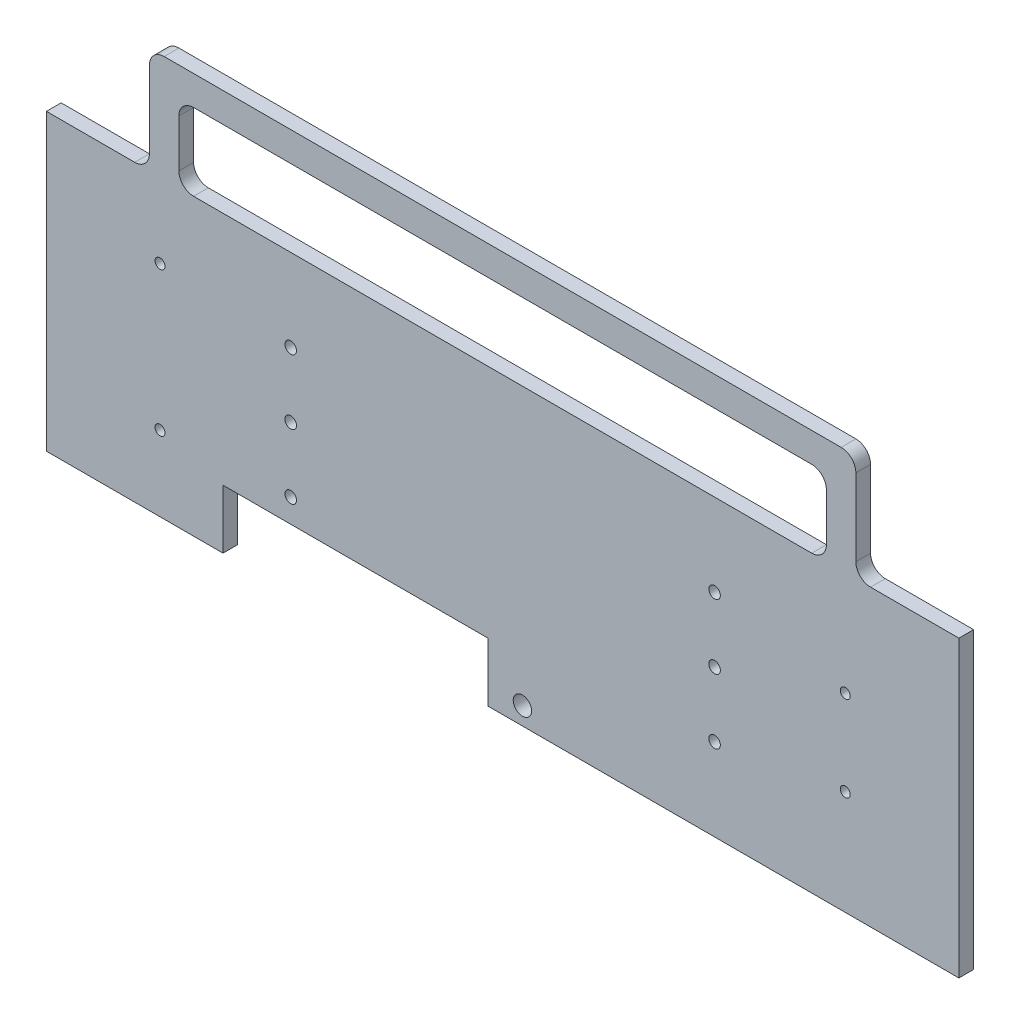
ISO-10303-21;
HEADER;
FILE_DESCRIPTION(('STEP AP214'),'2;1');
FILE_NAME('part.step','',(''),(''),'','','');
FILE_SCHEMA(('AUTOMOTIVE_DESIGN { 1 0 10303 214 1 1 1 1 }'));
ENDSEC;
DATA;
#1=APPLICATION_CONTEXT('core data for automotive mechanical design processes');
#2=APPLICATION_PROTOCOL_DEFINITION('international standard','automotive_design',2000,#1);
#3=PRODUCT_CONTEXT('',#1,'mechanical');
#4=PRODUCT('Part','Part','',(#3));
#5=PRODUCT_RELATED_PRODUCT_CATEGORY('part','',(#4));
#6=PRODUCT_DEFINITION_FORMATION('','',#4);
#7=PRODUCT_DEFINITION_CONTEXT('part definition',#1,'design');
#8=PRODUCT_DEFINITION('design','',#6,#7);
#9=PRODUCT_DEFINITION_SHAPE('','',#8);
#10=(LENGTH_UNIT() NAMED_UNIT(*) SI_UNIT(.MILLI.,.METRE.));
#11=(NAMED_UNIT(*) PLANE_ANGLE_UNIT() SI_UNIT($,.RADIAN.));
#12=(NAMED_UNIT(*) SI_UNIT($,.STERADIAN.) SOLID_ANGLE_UNIT());
#13=UNCERTAINTY_MEASURE_WITH_UNIT(LENGTH_MEASURE(1.E-05),#10,'distance_accuracy_value','');
#14=(GEOMETRIC_REPRESENTATION_CONTEXT(3) GLOBAL_UNCERTAINTY_ASSIGNED_CONTEXT((#13)) GLOBAL_UNIT_ASSIGNED_CONTEXT((#10,
#11,#12)) REPRESENTATION_CONTEXT('',''));
#15=CARTESIAN_POINT('',(0.,0.,0.));
#16=DIRECTION('',(0.,0.,1.));
#17=DIRECTION('',(1.,0.,0.));
#18=AXIS2_PLACEMENT_3D('',#15,#16,#17);
#19=CARTESIAN_POINT('',(-196.85,-63.5,6.35));
#20=DIRECTION('',(0.,1.,0.));
#21=DIRECTION('',(0.,0.,1.));
#22=AXIS2_PLACEMENT_3D('',#19,#20,#21);
#23=PLANE('',#22);
#24=DIRECTION('',(1.,0.,0.));
#25=VECTOR('',#24,1.);
#26=CARTESIAN_POINT('',(-196.85,-63.5,0.));
#27=LINE('',#26,#25);
#28=CARTESIAN_POINT('',(-196.85,-63.5,0.));
#29=VERTEX_POINT('',#28);
#30=CARTESIAN_POINT('',(-120.65,-63.5,0.));
#31=VERTEX_POINT('',#30);
#32=EDGE_CURVE('E218',#29,#31,#27,.T.);
#33=ORIENTED_EDGE('',*,*,#32,.T.);
#34=DIRECTION('',(0.,0.,1.));
#35=VECTOR('',#34,1.);
#36=CARTESIAN_POINT('',(-120.65,-63.5,0.));
#37=LINE('',#36,#35);
#38=CARTESIAN_POINT('',(-120.65,-63.5,6.35));
#39=VERTEX_POINT('',#38);
#40=EDGE_CURVE('E201',#31,#39,#37,.T.);
#41=ORIENTED_EDGE('',*,*,#40,.T.);
#42=DIRECTION('',(1.,0.,0.));
#43=VECTOR('',#42,1.);
#44=CARTESIAN_POINT('',(-196.85,-63.5,6.35));
#45=LINE('',#44,#43);
#46=CARTESIAN_POINT('',(-196.85,-63.5,6.35));
#47=VERTEX_POINT('',#46);
#48=EDGE_CURVE('E239',#47,#39,#45,.T.);
#49=ORIENTED_EDGE('',*,*,#48,.F.);
#50=DIRECTION('',(0.,0.,-1.));
#51=VECTOR('',#50,1.);
#52=CARTESIAN_POINT('',(-196.85,-63.5,6.35));
#53=LINE('',#52,#51);
#54=EDGE_CURVE('E225',#47,#29,#53,.T.);
#55=ORIENTED_EDGE('',*,*,#54,.T.);
#56=EDGE_LOOP('',(#33,#41,#49,#55));
#57=FACE_BOUND('',#56,.T.);
#58=ADVANCED_FACE('F39',(#57),#23,.F.);
#59=CARTESIAN_POINT('',(-196.85,63.5,6.35));
#60=DIRECTION('',(0.,-1.,0.));
#61=DIRECTION('',(0.,0.,-1.));
#62=AXIS2_PLACEMENT_3D('',#59,#60,#61);
#63=PLANE('',#62);
#64=DIRECTION('',(-1.,0.,0.));
#65=VECTOR('',#64,1.);
#66=CARTESIAN_POINT('',(-196.85,63.5,6.35));
#67=LINE('',#66,#65);
#68=CARTESIAN_POINT('',(-158.75,63.5,6.35));
#69=VERTEX_POINT('',#68);
#70=CARTESIAN_POINT('',(-196.85,63.5,6.35));
#71=VERTEX_POINT('',#70);
#72=EDGE_CURVE('E230',#69,#71,#67,.T.);
#73=ORIENTED_EDGE('',*,*,#72,.F.);
#74=DIRECTION('',(0.,0.,1.));
#75=VECTOR('',#74,1.);
#76=CARTESIAN_POINT('',(-158.75,63.5,0.));
#77=LINE('',#76,#75);
#78=CARTESIAN_POINT('',(-158.75,63.5,0.));
#79=VERTEX_POINT('',#78);
#80=EDGE_CURVE('E270',#69,#79,#77,.F.);
#81=ORIENTED_EDGE('',*,*,#80,.T.);
#82=DIRECTION('',(-1.,0.,0.));
#83=VECTOR('',#82,1.);
#84=CARTESIAN_POINT('',(-196.85,63.5,0.));
#85=LINE('',#84,#83);
#86=CARTESIAN_POINT('',(-196.85,63.5,0.));
#87=VERTEX_POINT('',#86);
#88=EDGE_CURVE('E405',#79,#87,#85,.T.);
#89=ORIENTED_EDGE('',*,*,#88,.T.);
#90=DIRECTION('',(0.,0.,-1.));
#91=VECTOR('',#90,1.);
#92=CARTESIAN_POINT('',(-196.85,63.5,6.35));
#93=LINE('',#92,#91);
#94=EDGE_CURVE('E241',#71,#87,#93,.T.);
#95=ORIENTED_EDGE('',*,*,#94,.F.);
#96=EDGE_LOOP('',(#73,#81,#89,#95));
#97=FACE_BOUND('',#96,.T.);
#98=ADVANCED_FACE('F416',(#97),#63,.F.);
#99=CARTESIAN_POINT('',(133.35,63.5,6.35));
#100=VERTEX_POINT('',#99);
#101=CARTESIAN_POINT('',(-133.35,63.5,6.35));
#102=VERTEX_POINT('',#101);
#103=EDGE_CURVE('E400',#100,#102,#67,.T.);
#104=ORIENTED_EDGE('',*,*,#103,.F.);
#105=DIRECTION('',(0.,0.,1.));
#106=VECTOR('',#105,1.);
#107=CARTESIAN_POINT('',(133.35,63.5,0.));
#108=LINE('',#107,#106);
#109=CARTESIAN_POINT('',(133.35,63.5,0.));
#110=VERTEX_POINT('',#109);
#111=EDGE_CURVE('E288',#100,#110,#108,.F.);
#112=ORIENTED_EDGE('',*,*,#111,.T.);
#113=CARTESIAN_POINT('',(-133.35,63.5,0.));
#114=VERTEX_POINT('',#113);
#115=EDGE_CURVE('E408',#110,#114,#85,.T.);
#116=ORIENTED_EDGE('',*,*,#115,.T.);
#117=DIRECTION('',(0.,0.,1.));
#118=VECTOR('',#117,1.);
#119=CARTESIAN_POINT('',(-133.35,63.5,6.35));
#120=LINE('',#119,#118);
#121=EDGE_CURVE('E285',#114,#102,#120,.T.);
#122=ORIENTED_EDGE('',*,*,#121,.T.);
#123=EDGE_LOOP('',(#104,#112,#116,#122));
#124=FACE_BOUND('',#123,.T.);
#125=ADVANCED_FACE('F429',(#124),#63,.F.);
#126=CARTESIAN_POINT('',(196.85,63.5,6.35));
#127=DIRECTION('',(-1.,0.,0.));
#128=DIRECTION('',(0.,-1.,0.));
#129=AXIS2_PLACEMENT_3D('',#126,#127,#128);
#130=PLANE('',#129);
#131=DIRECTION('',(0.,1.,0.));
#132=VECTOR('',#131,1.);
#133=CARTESIAN_POINT('',(196.85,63.5,0.));
#134=LINE('',#133,#132);
#135=CARTESIAN_POINT('',(196.85,-63.5,0.));
#136=VERTEX_POINT('',#135);
#137=CARTESIAN_POINT('',(196.85,63.5,0.));
#138=VERTEX_POINT('',#137);
#139=EDGE_CURVE('E394',#136,#138,#134,.T.);
#140=ORIENTED_EDGE('',*,*,#139,.T.);
#141=DIRECTION('',(0.,0.,-1.));
#142=VECTOR('',#141,1.);
#143=CARTESIAN_POINT('',(196.85,63.5,6.35));
#144=LINE('',#143,#142);
#145=CARTESIAN_POINT('',(196.85,63.5,6.35));
#146=VERTEX_POINT('',#145);
#147=EDGE_CURVE('E244',#146,#138,#144,.T.);
#148=ORIENTED_EDGE('',*,*,#147,.F.);
#149=DIRECTION('',(0.,1.,0.));
#150=VECTOR('',#149,1.);
#151=CARTESIAN_POINT('',(196.85,63.5,6.35));
#152=LINE('',#151,#150);
#153=CARTESIAN_POINT('',(196.85,-63.5,6.35));
#154=VERTEX_POINT('',#153);
#155=EDGE_CURVE('E226',#154,#146,#152,.T.);
#156=ORIENTED_EDGE('',*,*,#155,.F.);
#157=DIRECTION('',(0.,0.,-1.));
#158=VECTOR('',#157,1.);
#159=CARTESIAN_POINT('',(196.85,-63.5,6.35));
#160=LINE('',#159,#158);
#161=EDGE_CURVE('E236',#154,#136,#160,.T.);
#162=ORIENTED_EDGE('',*,*,#161,.T.);
#163=EDGE_LOOP('',(#140,#148,#156,#162));
#164=FACE_BOUND('',#163,.T.);
#165=ADVANCED_FACE('F473',(#164),#130,.F.);
#166=CARTESIAN_POINT('',(158.75,63.5,0.));
#167=VERTEX_POINT('',#166);
#168=EDGE_CURVE('E406',#138,#167,#85,.T.);
#169=ORIENTED_EDGE('',*,*,#168,.T.);
#170=DIRECTION('',(0.,0.,1.));
#171=VECTOR('',#170,1.);
#172=CARTESIAN_POINT('',(158.75,63.5,6.35));
#173=LINE('',#172,#171);
#174=CARTESIAN_POINT('',(158.75,63.5,6.35));
#175=VERTEX_POINT('',#174);
#176=EDGE_CURVE('E272',#167,#175,#173,.T.);
#177=ORIENTED_EDGE('',*,*,#176,.T.);
#178=EDGE_CURVE('E396',#146,#175,#67,.T.);
#179=ORIENTED_EDGE('',*,*,#178,.F.);
#180=ORIENTED_EDGE('',*,*,#147,.T.);
#181=EDGE_LOOP('',(#169,#177,#179,#180));
#182=FACE_BOUND('',#181,.T.);
#183=ADVANCED_FACE('F466',(#182),#63,.F.);
#184=CARTESIAN_POINT('',(-196.85,63.5,6.35));
#185=DIRECTION('',(1.,0.,0.));
#186=DIRECTION('',(0.,1.,0.));
#187=AXIS2_PLACEMENT_3D('',#184,#185,#186);
#188=PLANE('',#187);
#189=DIRECTION('',(0.,-1.,0.));
#190=VECTOR('',#189,1.);
#191=CARTESIAN_POINT('',(-196.85,63.5,0.));
#192=LINE('',#191,#190);
#193=EDGE_CURVE('E232',#87,#29,#192,.T.);
#194=ORIENTED_EDGE('',*,*,#193,.T.);
#195=ORIENTED_EDGE('',*,*,#54,.F.);
#196=DIRECTION('',(0.,-1.,0.));
#197=VECTOR('',#196,1.);
#198=CARTESIAN_POINT('',(-196.85,63.5,6.35));
#199=LINE('',#198,#197);
#200=EDGE_CURVE('E399',#71,#47,#199,.T.);
#201=ORIENTED_EDGE('',*,*,#200,.F.);
#202=ORIENTED_EDGE('',*,*,#94,.T.);
#203=EDGE_LOOP('',(#194,#195,#201,#202));
#204=FACE_BOUND('',#203,.T.);
#205=ADVANCED_FACE('F421',(#204),#188,.F.);
#206=CARTESIAN_POINT('',(-6.35000000000001,-63.5,6.35));
#207=VERTEX_POINT('',#206);
#208=EDGE_CURVE('E402',#207,#154,#45,.T.);
#209=ORIENTED_EDGE('',*,*,#208,.F.);
#210=DIRECTION('',(0.,0.,1.));
#211=VECTOR('',#210,1.);
#212=CARTESIAN_POINT('',(-6.35000000000001,-63.5,0.));
#213=LINE('',#212,#211);
#214=CARTESIAN_POINT('',(-6.35000000000001,-63.5,0.));
#215=VERTEX_POINT('',#214);
#216=EDGE_CURVE('E211',#215,#207,#213,.T.);
#217=ORIENTED_EDGE('',*,*,#216,.F.);
#218=EDGE_CURVE('E227',#215,#136,#27,.T.);
#219=ORIENTED_EDGE('',*,*,#218,.T.);
#220=ORIENTED_EDGE('',*,*,#161,.F.);
#221=EDGE_LOOP('',(#209,#217,#219,#220));
#222=FACE_BOUND('',#221,.T.);
#223=ADVANCED_FACE('F478',(#222),#23,.F.);
#224=CARTESIAN_POINT('',(0.,0.,6.35));
#225=DIRECTION('',(0.,0.,1.));
#226=DIRECTION('',(1.,0.,0.));
#227=AXIS2_PLACEMENT_3D('',#224,#225,#226);
#228=PLANE('',#227);
#229=CARTESIAN_POINT('',(8.53490799999999,-55.88,6.35));
#230=DIRECTION('',(0.,0.,1.));
#231=DIRECTION('',(1.,0.,0.));
#232=AXIS2_PLACEMENT_3D('',#229,#230,#231);
#233=CIRCLE('',#232,3.96875);
#234=CARTESIAN_POINT('',(12.503658,-55.88,6.35));
#235=VERTEX_POINT('',#234);
#236=EDGE_CURVE('E971',#235,#235,#233,.T.);
#237=ORIENTED_EDGE('',*,*,#236,.F.);
#238=EDGE_LOOP('',(#237));
#239=FACE_BOUND('',#238,.T.);
#240=DIRECTION('',(0.,-1.,0.));
#241=VECTOR('',#240,1.);
#242=CARTESIAN_POINT('',(-120.65,-63.5,6.35));
#243=LINE('',#242,#241);
#244=CARTESIAN_POINT('',(-120.65,-38.1,6.35));
#245=VERTEX_POINT('',#244);
#246=EDGE_CURVE('E206',#245,#39,#243,.T.);
#247=ORIENTED_EDGE('',*,*,#246,.F.);
#248=DIRECTION('',(-1.,0.,0.));
#249=VECTOR('',#248,1.);
#250=CARTESIAN_POINT('',(-120.65,-38.1,6.35));
#251=LINE('',#250,#249);
#252=CARTESIAN_POINT('',(-6.35000000000002,-38.1,6.35));
#253=VERTEX_POINT('',#252);
#254=EDGE_CURVE('E221',#253,#245,#251,.T.);
#255=ORIENTED_EDGE('',*,*,#254,.F.);
#256=DIRECTION('',(0.,1.,0.));
#257=VECTOR('',#256,1.);
#258=CARTESIAN_POINT('',(-6.35000000000001,-63.5,6.35));
#259=LINE('',#258,#257);
#260=EDGE_CURVE('E978',#207,#253,#259,.T.);
#261=ORIENTED_EDGE('',*,*,#260,.F.);
#262=ORIENTED_EDGE('',*,*,#208,.T.);
#263=ORIENTED_EDGE('',*,*,#155,.T.);
#264=ORIENTED_EDGE('',*,*,#178,.T.);
#265=CARTESIAN_POINT('',(158.75,69.85,6.35));
#266=DIRECTION('',(0.,0.,1.));
#267=DIRECTION('',(1.,0.,0.));
#268=AXIS2_PLACEMENT_3D('',#265,#266,#267);
#269=CIRCLE('',#268,6.35);
#270=CARTESIAN_POINT('',(152.4,69.85,6.35));
#271=VERTEX_POINT('',#270);
#272=EDGE_CURVE('E299',#175,#271,#269,.F.);
#273=ORIENTED_EDGE('',*,*,#272,.T.);
#274=DIRECTION('',(0.,1.,0.));
#275=VECTOR('',#274,1.);
#276=CARTESIAN_POINT('',(152.4,0.,6.35));
#277=LINE('',#276,#275);
#278=CARTESIAN_POINT('',(152.4,103.033049990493,6.35));
#279=VERTEX_POINT('',#278);
#280=EDGE_CURVE('E353',#271,#279,#277,.T.);
#281=ORIENTED_EDGE('',*,*,#280,.T.);
#282=CARTESIAN_POINT('',(146.05,103.033049990493,6.35));
#283=DIRECTION('',(0.,0.,1.));
#284=DIRECTION('',(1.,0.,0.));
#285=AXIS2_PLACEMENT_3D('',#282,#283,#284);
#286=CIRCLE('',#285,6.35);
#287=CARTESIAN_POINT('',(146.05,109.383049990493,6.35));
#288=VERTEX_POINT('',#287);
#289=EDGE_CURVE('E254',#279,#288,#286,.T.);
#290=ORIENTED_EDGE('',*,*,#289,.T.);
#291=DIRECTION('',(1.,0.,0.));
#292=VECTOR('',#291,1.);
#293=CARTESIAN_POINT('',(0.,109.383049990493,6.35));
#294=LINE('',#293,#292);
#295=CARTESIAN_POINT('',(-146.05,109.383049990493,6.35));
#296=VERTEX_POINT('',#295);
#297=EDGE_CURVE('E356',#296,#288,#294,.T.);
#298=ORIENTED_EDGE('',*,*,#297,.F.);
#299=CARTESIAN_POINT('',(-146.05,103.033049990493,6.35));
#300=DIRECTION('',(0.,0.,1.));
#301=DIRECTION('',(1.,0.,0.));
#302=AXIS2_PLACEMENT_3D('',#299,#300,#301);
#303=CIRCLE('',#302,6.35);
#304=CARTESIAN_POINT('',(-152.4,103.033049990493,6.35));
#305=VERTEX_POINT('',#304);
#306=EDGE_CURVE('E252',#296,#305,#303,.T.);
#307=ORIENTED_EDGE('',*,*,#306,.T.);
#308=DIRECTION('',(0.,1.,0.));
#309=VECTOR('',#308,1.);
#310=CARTESIAN_POINT('',(-152.4,0.,6.35));
#311=LINE('',#310,#309);
#312=CARTESIAN_POINT('',(-152.4,69.85,6.35));
#313=VERTEX_POINT('',#312);
#314=EDGE_CURVE('E359',#313,#305,#311,.T.);
#315=ORIENTED_EDGE('',*,*,#314,.F.);
#316=CARTESIAN_POINT('',(-158.75,69.85,6.35));
#317=DIRECTION('',(0.,0.,1.));
#318=DIRECTION('',(1.,0.,0.));
#319=AXIS2_PLACEMENT_3D('',#316,#317,#318);
#320=CIRCLE('',#319,6.35);
#321=EDGE_CURVE('E295',#313,#69,#320,.F.);
#322=ORIENTED_EDGE('',*,*,#321,.T.);
#323=ORIENTED_EDGE('',*,*,#72,.T.);
#324=ORIENTED_EDGE('',*,*,#200,.T.);
#325=ORIENTED_EDGE('',*,*,#48,.T.);
#326=EDGE_LOOP('',(#247,#255,#261,#262,#263,#264,#273,#281,#290,#298,#307,#315,#322,#323,#324,#325));
#327=FACE_BOUND('',#326,.T.);
#328=CARTESIAN_POINT('',(-147.828,31.115,6.35));
#329=DIRECTION('',(0.,0.,1.));
#330=DIRECTION('',(1.,0.,0.));
#331=AXIS2_PLACEMENT_3D('',#328,#329,#330);
#332=CIRCLE('',#331,2.15265000000001);
#333=CARTESIAN_POINT('',(-145.67535,31.115,6.35));
#334=VERTEX_POINT('',#333);
#335=EDGE_CURVE('E487',#334,#334,#332,.T.);
#336=ORIENTED_EDGE('',*,*,#335,.F.);
#337=EDGE_LOOP('',(#336));
#338=FACE_BOUND('',#337,.T.);
#339=CARTESIAN_POINT('',(-147.828,-31.115,6.35));
#340=DIRECTION('',(0.,0.,1.));
#341=DIRECTION('',(1.,0.,0.));
#342=AXIS2_PLACEMENT_3D('',#339,#340,#341);
#343=CIRCLE('',#342,2.15265000000001);
#344=CARTESIAN_POINT('',(-145.67535,-31.115,6.35));
#345=VERTEX_POINT('',#344);
#346=EDGE_CURVE('E493',#345,#345,#343,.T.);
#347=ORIENTED_EDGE('',*,*,#346,.F.);
#348=EDGE_LOOP('',(#347));
#349=FACE_BOUND('',#348,.T.);
#350=CARTESIAN_POINT('',(147.828,18.415,6.35));
#351=DIRECTION('',(0.,0.,1.));
#352=DIRECTION('',(1.,0.,0.));
#353=AXIS2_PLACEMENT_3D('',#350,#351,#352);
#354=CIRCLE('',#353,2.15265000000001);
#355=CARTESIAN_POINT('',(149.98065,18.415,6.35));
#356=VERTEX_POINT('',#355);
#357=EDGE_CURVE('E499',#356,#356,#354,.T.);
#358=ORIENTED_EDGE('',*,*,#357,.F.);
#359=EDGE_LOOP('',(#358));
#360=FACE_BOUND('',#359,.T.);
#361=CARTESIAN_POINT('',(147.828,-18.415,6.35));
#362=DIRECTION('',(0.,0.,1.));
#363=DIRECTION('',(1.,0.,0.));
#364=AXIS2_PLACEMENT_3D('',#361,#362,#363);
#365=CIRCLE('',#364,2.15265000000001);
#366=CARTESIAN_POINT('',(149.98065,-18.415,6.35));
#367=VERTEX_POINT('',#366);
#368=EDGE_CURVE('E505',#367,#367,#365,.T.);
#369=ORIENTED_EDGE('',*,*,#368,.F.);
#370=EDGE_LOOP('',(#369));
#371=FACE_BOUND('',#370,.T.);
#372=CARTESIAN_POINT('',(-91.44,27.94,6.35));
#373=DIRECTION('',(0.,0.,1.));
#374=DIRECTION('',(1.,0.,0.));
#375=AXIS2_PLACEMENT_3D('',#372,#373,#374);
#376=CIRCLE('',#375,2.48919999999998);
#377=CARTESIAN_POINT('',(-88.9508,27.94,6.35));
#378=VERTEX_POINT('',#377);
#379=EDGE_CURVE('E340',#378,#378,#376,.T.);
#380=ORIENTED_EDGE('',*,*,#379,.F.);
#381=EDGE_LOOP('',(#380));
#382=FACE_BOUND('',#381,.T.);
#383=CARTESIAN_POINT('',(-91.44,-27.94,6.35));
#384=DIRECTION('',(0.,0.,1.));
#385=DIRECTION('',(1.,0.,0.));
#386=AXIS2_PLACEMENT_3D('',#383,#384,#385);
#387=CIRCLE('',#386,2.48919999999998);
#388=CARTESIAN_POINT('',(-88.9508,-27.94,6.35));
#389=VERTEX_POINT('',#388);
#390=EDGE_CURVE('E365',#389,#389,#387,.T.);
#391=ORIENTED_EDGE('',*,*,#390,.F.);
#392=EDGE_LOOP('',(#391));
#393=FACE_BOUND('',#392,.T.);
#394=CARTESIAN_POINT('',(91.44,27.94,6.35));
#395=DIRECTION('',(0.,0.,1.));
#396=DIRECTION('',(1.,0.,0.));
#397=AXIS2_PLACEMENT_3D('',#394,#395,#396);
#398=CIRCLE('',#397,2.48919999999998);
#399=CARTESIAN_POINT('',(93.9292,27.94,6.35));
#400=VERTEX_POINT('',#399);
#401=EDGE_CURVE('E371',#400,#400,#398,.T.);
#402=ORIENTED_EDGE('',*,*,#401,.F.);
#403=EDGE_LOOP('',(#402));
#404=FACE_BOUND('',#403,.T.);
#405=CARTESIAN_POINT('',(91.44,-27.94,6.35));
#406=DIRECTION('',(0.,0.,1.));
#407=DIRECTION('',(1.,0.,0.));
#408=AXIS2_PLACEMENT_3D('',#405,#406,#407);
#409=CIRCLE('',#408,2.48919999999998);
#410=CARTESIAN_POINT('',(93.9292,-27.94,6.35));
#411=VERTEX_POINT('',#410);
#412=EDGE_CURVE('E377',#411,#411,#409,.T.);
#413=ORIENTED_EDGE('',*,*,#412,.F.);
#414=EDGE_LOOP('',(#413));
#415=FACE_BOUND('',#414,.T.);
#416=CARTESIAN_POINT('',(-91.44,0.,6.35));
#417=DIRECTION('',(0.,0.,1.));
#418=DIRECTION('',(1.,0.,0.));
#419=AXIS2_PLACEMENT_3D('',#416,#417,#418);
#420=CIRCLE('',#419,2.48919999999998);
#421=CARTESIAN_POINT('',(-88.9508,0.,6.35));
#422=VERTEX_POINT('',#421);
#423=EDGE_CURVE('E383',#422,#422,#420,.T.);
#424=ORIENTED_EDGE('',*,*,#423,.F.);
#425=EDGE_LOOP('',(#424));
#426=FACE_BOUND('',#425,.T.);
#427=CARTESIAN_POINT('',(91.44,0.,6.35));
#428=DIRECTION('',(0.,0.,1.));
#429=DIRECTION('',(1.,0.,0.));
#430=AXIS2_PLACEMENT_3D('',#427,#428,#429);
#431=CIRCLE('',#430,2.48919999999998);
#432=CARTESIAN_POINT('',(93.9292,0.,6.35));
#433=VERTEX_POINT('',#432);
#434=EDGE_CURVE('E389',#433,#433,#431,.T.);
#435=ORIENTED_EDGE('',*,*,#434,.F.);
#436=EDGE_LOOP('',(#435));
#437=FACE_BOUND('',#436,.T.);
#438=DIRECTION('',(0.,1.,0.));
#439=VECTOR('',#438,1.);
#440=CARTESIAN_POINT('',(139.7,0.,6.35));
#441=LINE('',#440,#439);
#442=CARTESIAN_POINT('',(139.7,69.85,6.35));
#443=VERTEX_POINT('',#442);
#444=CARTESIAN_POINT('',(139.7,90.3330499904934,6.35));
#445=VERTEX_POINT('',#444);
#446=EDGE_CURVE('E328',#443,#445,#441,.T.);
#447=ORIENTED_EDGE('',*,*,#446,.F.);
#448=CARTESIAN_POINT('',(133.35,69.85,6.35));
#449=DIRECTION('',(0.,0.,1.));
#450=DIRECTION('',(1.,0.,0.));
#451=AXIS2_PLACEMENT_3D('',#448,#449,#450);
#452=CIRCLE('',#451,6.35);
#453=EDGE_CURVE('E306',#443,#100,#452,.F.);
#454=ORIENTED_EDGE('',*,*,#453,.T.);
#455=ORIENTED_EDGE('',*,*,#103,.T.);
#456=CARTESIAN_POINT('',(-133.35,69.85,6.35));
#457=DIRECTION('',(0.,0.,1.));
#458=DIRECTION('',(1.,0.,0.));
#459=AXIS2_PLACEMENT_3D('',#456,#457,#458);
#460=CIRCLE('',#459,6.35);
#461=CARTESIAN_POINT('',(-139.7,69.85,6.35));
#462=VERTEX_POINT('',#461);
#463=EDGE_CURVE('E310',#102,#462,#460,.F.);
#464=ORIENTED_EDGE('',*,*,#463,.T.);
#465=DIRECTION('',(0.,1.,0.));
#466=VECTOR('',#465,1.);
#467=CARTESIAN_POINT('',(-139.7,0.,6.35));
#468=LINE('',#467,#466);
#469=CARTESIAN_POINT('',(-139.7,90.3330499904934,6.35));
#470=VERTEX_POINT('',#469);
#471=EDGE_CURVE('E321',#462,#470,#468,.T.);
#472=ORIENTED_EDGE('',*,*,#471,.T.);
#473=CARTESIAN_POINT('',(-133.35,90.3330499904934,6.35));
#474=DIRECTION('',(0.,0.,1.));
#475=DIRECTION('',(1.,0.,0.));
#476=AXIS2_PLACEMENT_3D('',#473,#474,#475);
#477=CIRCLE('',#476,6.35);
#478=CARTESIAN_POINT('',(-133.35,96.6830499904934,6.35));
#479=VERTEX_POINT('',#478);
#480=EDGE_CURVE('E47',#470,#479,#477,.F.);
#481=ORIENTED_EDGE('',*,*,#480,.T.);
#482=DIRECTION('',(1.,0.,0.));
#483=VECTOR('',#482,1.);
#484=CARTESIAN_POINT('',(0.,96.6830499904934,6.35));
#485=LINE('',#484,#483);
#486=CARTESIAN_POINT('',(133.35,96.6830499904934,6.35));
#487=VERTEX_POINT('',#486);
#488=EDGE_CURVE('E319',#479,#487,#485,.T.);
#489=ORIENTED_EDGE('',*,*,#488,.T.);
#490=CARTESIAN_POINT('',(133.35,90.3330499904934,6.35));
#491=DIRECTION('',(0.,0.,1.));
#492=DIRECTION('',(1.,0.,0.));
#493=AXIS2_PLACEMENT_3D('',#490,#491,#492);
#494=CIRCLE('',#493,6.35);
#495=EDGE_CURVE('E303',#487,#445,#494,.F.);
#496=ORIENTED_EDGE('',*,*,#495,.T.);
#497=EDGE_LOOP('',(#447,#454,#455,#464,#472,#481,#489,#496));
#498=FACE_BOUND('',#497,.T.);
#499=ADVANCED_FACE('F318',(#239,#327,#338,#349,#360,#371,#382,#393,#404,#415,#426,#437,#498),
#228,.T.);
#500=CARTESIAN_POINT('',(0.,0.,0.));
#501=DIRECTION('',(0.,0.,1.));
#502=DIRECTION('',(1.,0.,0.));
#503=AXIS2_PLACEMENT_3D('',#500,#501,#502);
#504=PLANE('',#503);
#505=CARTESIAN_POINT('',(8.53490799999999,-55.88,0.));
#506=DIRECTION('',(0.,0.,1.));
#507=DIRECTION('',(1.,0.,0.));
#508=AXIS2_PLACEMENT_3D('',#505,#506,#507);
#509=CIRCLE('',#508,3.96875);
#510=CARTESIAN_POINT('',(12.503658,-55.88,0.));
#511=VERTEX_POINT('',#510);
#512=EDGE_CURVE('E968',#511,#511,#509,.T.);
#513=ORIENTED_EDGE('',*,*,#512,.T.);
#514=EDGE_LOOP('',(#513));
#515=FACE_BOUND('',#514,.T.);
#516=CARTESIAN_POINT('',(-147.828,31.115,0.));
#517=DIRECTION('',(0.,0.,1.));
#518=DIRECTION('',(1.,0.,0.));
#519=AXIS2_PLACEMENT_3D('',#516,#517,#518);
#520=CIRCLE('',#519,2.15265000000001);
#521=CARTESIAN_POINT('',(-145.67535,31.115,0.));
#522=VERTEX_POINT('',#521);
#523=EDGE_CURVE('E490',#522,#522,#520,.T.);
#524=ORIENTED_EDGE('',*,*,#523,.T.);
#525=EDGE_LOOP('',(#524));
#526=FACE_BOUND('',#525,.T.);
#527=CARTESIAN_POINT('',(-147.828,-31.115,0.));
#528=DIRECTION('',(0.,0.,1.));
#529=DIRECTION('',(1.,0.,0.));
#530=AXIS2_PLACEMENT_3D('',#527,#528,#529);
#531=CIRCLE('',#530,2.15265000000001);
#532=CARTESIAN_POINT('',(-145.67535,-31.115,0.));
#533=VERTEX_POINT('',#532);
#534=EDGE_CURVE('E496',#533,#533,#531,.T.);
#535=ORIENTED_EDGE('',*,*,#534,.T.);
#536=EDGE_LOOP('',(#535));
#537=FACE_BOUND('',#536,.T.);
#538=CARTESIAN_POINT('',(147.828,18.415,0.));
#539=DIRECTION('',(0.,0.,1.));
#540=DIRECTION('',(1.,0.,0.));
#541=AXIS2_PLACEMENT_3D('',#538,#539,#540);
#542=CIRCLE('',#541,2.15265000000001);
#543=CARTESIAN_POINT('',(149.98065,18.415,0.));
#544=VERTEX_POINT('',#543);
#545=EDGE_CURVE('E502',#544,#544,#542,.T.);
#546=ORIENTED_EDGE('',*,*,#545,.T.);
#547=EDGE_LOOP('',(#546));
#548=FACE_BOUND('',#547,.T.);
#549=CARTESIAN_POINT('',(147.828,-18.415,0.));
#550=DIRECTION('',(0.,0.,1.));
#551=DIRECTION('',(1.,0.,0.));
#552=AXIS2_PLACEMENT_3D('',#549,#550,#551);
#553=CIRCLE('',#552,2.15265000000001);
#554=CARTESIAN_POINT('',(149.98065,-18.415,0.));
#555=VERTEX_POINT('',#554);
#556=EDGE_CURVE('E329',#555,#555,#553,.T.);
#557=ORIENTED_EDGE('',*,*,#556,.T.);
#558=EDGE_LOOP('',(#557));
#559=FACE_BOUND('',#558,.T.);
#560=DIRECTION('',(-1.,0.,0.));
#561=VECTOR('',#560,1.);
#562=CARTESIAN_POINT('',(-120.65,-38.1,0.));
#563=LINE('',#562,#561);
#564=CARTESIAN_POINT('',(-6.35000000000002,-38.1,0.));
#565=VERTEX_POINT('',#564);
#566=CARTESIAN_POINT('',(-120.65,-38.1,0.));
#567=VERTEX_POINT('',#566);
#568=EDGE_CURVE('E54',#565,#567,#563,.T.);
#569=ORIENTED_EDGE('',*,*,#568,.T.);
#570=DIRECTION('',(0.,-1.,0.));
#571=VECTOR('',#570,1.);
#572=CARTESIAN_POINT('',(-120.65,-63.5,0.));
#573=LINE('',#572,#571);
#574=EDGE_CURVE('E204',#567,#31,#573,.T.);
#575=ORIENTED_EDGE('',*,*,#574,.T.);
#576=ORIENTED_EDGE('',*,*,#32,.F.);
#577=ORIENTED_EDGE('',*,*,#193,.F.);
#578=ORIENTED_EDGE('',*,*,#88,.F.);
#579=CARTESIAN_POINT('',(-158.75,69.85,0.));
#580=DIRECTION('',(0.,0.,1.));
#581=DIRECTION('',(1.,0.,0.));
#582=AXIS2_PLACEMENT_3D('',#579,#580,#581);
#583=CIRCLE('',#582,6.35);
#584=CARTESIAN_POINT('',(-152.4,69.85,0.));
#585=VERTEX_POINT('',#584);
#586=EDGE_CURVE('E297',#79,#585,#583,.T.);
#587=ORIENTED_EDGE('',*,*,#586,.T.);
#588=DIRECTION('',(0.,1.,0.));
#589=VECTOR('',#588,1.);
#590=CARTESIAN_POINT('',(-152.4,0.,0.));
#591=LINE('',#590,#589);
#592=CARTESIAN_POINT('',(-152.4,103.033049990493,0.));
#593=VERTEX_POINT('',#592);
#594=EDGE_CURVE('E341',#585,#593,#591,.T.);
#595=ORIENTED_EDGE('',*,*,#594,.T.);
#596=CARTESIAN_POINT('',(-146.05,103.033049990493,0.));
#597=DIRECTION('',(0.,0.,1.));
#598=DIRECTION('',(1.,0.,0.));
#599=AXIS2_PLACEMENT_3D('',#596,#597,#598);
#600=CIRCLE('',#599,6.35);
#601=CARTESIAN_POINT('',(-146.05,109.383049990493,0.));
#602=VERTEX_POINT('',#601);
#603=EDGE_CURVE('E261',#593,#602,#600,.F.);
#604=ORIENTED_EDGE('',*,*,#603,.T.);
#605=DIRECTION('',(1.,0.,0.));
#606=VECTOR('',#605,1.);
#607=CARTESIAN_POINT('',(0.,109.383049990493,0.));
#608=LINE('',#607,#606);
#609=CARTESIAN_POINT('',(146.05,109.383049990493,0.));
#610=VERTEX_POINT('',#609);
#611=EDGE_CURVE('E347',#602,#610,#608,.T.);
#612=ORIENTED_EDGE('',*,*,#611,.T.);
#613=CARTESIAN_POINT('',(146.05,103.033049990493,0.));
#614=DIRECTION('',(0.,0.,1.));
#615=DIRECTION('',(1.,0.,0.));
#616=AXIS2_PLACEMENT_3D('',#613,#614,#615);
#617=CIRCLE('',#616,6.35);
#618=CARTESIAN_POINT('',(152.4,103.033049990493,0.));
#619=VERTEX_POINT('',#618);
#620=EDGE_CURVE('E263',#610,#619,#617,.F.);
#621=ORIENTED_EDGE('',*,*,#620,.T.);
#622=DIRECTION('',(0.,1.,0.));
#623=VECTOR('',#622,1.);
#624=CARTESIAN_POINT('',(152.4,0.,0.));
#625=LINE('',#624,#623);
#626=CARTESIAN_POINT('',(152.4,69.85,0.));
#627=VERTEX_POINT('',#626);
#628=EDGE_CURVE('E441',#627,#619,#625,.T.);
#629=ORIENTED_EDGE('',*,*,#628,.F.);
#630=CARTESIAN_POINT('',(158.75,69.85,0.));
#631=DIRECTION('',(0.,0.,1.));
#632=DIRECTION('',(1.,0.,0.));
#633=AXIS2_PLACEMENT_3D('',#630,#631,#632);
#634=CIRCLE('',#633,6.35);
#635=EDGE_CURVE('E301',#627,#167,#634,.T.);
#636=ORIENTED_EDGE('',*,*,#635,.T.);
#637=ORIENTED_EDGE('',*,*,#168,.F.);
#638=ORIENTED_EDGE('',*,*,#139,.F.);
#639=ORIENTED_EDGE('',*,*,#218,.F.);
#640=DIRECTION('',(0.,1.,0.));
#641=VECTOR('',#640,1.);
#642=CARTESIAN_POINT('',(-6.35000000000001,-63.5,0.));
#643=LINE('',#642,#641);
#644=EDGE_CURVE('E220',#215,#565,#643,.T.);
#645=ORIENTED_EDGE('',*,*,#644,.T.);
#646=EDGE_LOOP('',(#569,#575,#576,#577,#578,#587,#595,#604,#612,#621,#629,#636,#637,#638,#639,#645));
#647=FACE_BOUND('',#646,.T.);
#648=CARTESIAN_POINT('',(-91.44,27.94,0.));
#649=DIRECTION('',(0.,0.,1.));
#650=DIRECTION('',(1.,0.,0.));
#651=AXIS2_PLACEMENT_3D('',#648,#649,#650);
#652=CIRCLE('',#651,2.4892);
#653=CARTESIAN_POINT('',(-88.9508,27.94,0.));
#654=VERTEX_POINT('',#653);
#655=EDGE_CURVE('E344',#654,#654,#652,.T.);
#656=ORIENTED_EDGE('',*,*,#655,.T.);
#657=EDGE_LOOP('',(#656));
#658=FACE_BOUND('',#657,.T.);
#659=CARTESIAN_POINT('',(-91.44,-27.94,0.));
#660=DIRECTION('',(0.,0.,1.));
#661=DIRECTION('',(1.,0.,0.));
#662=AXIS2_PLACEMENT_3D('',#659,#660,#661);
#663=CIRCLE('',#662,2.4892);
#664=CARTESIAN_POINT('',(-88.9508,-27.94,0.));
#665=VERTEX_POINT('',#664);
#666=EDGE_CURVE('E368',#665,#665,#663,.T.);
#667=ORIENTED_EDGE('',*,*,#666,.T.);
#668=EDGE_LOOP('',(#667));
#669=FACE_BOUND('',#668,.T.);
#670=CARTESIAN_POINT('',(91.44,27.94,0.));
#671=DIRECTION('',(0.,0.,1.));
#672=DIRECTION('',(1.,0.,0.));
#673=AXIS2_PLACEMENT_3D('',#670,#671,#672);
#674=CIRCLE('',#673,2.4892);
#675=CARTESIAN_POINT('',(93.9292,27.94,0.));
#676=VERTEX_POINT('',#675);
#677=EDGE_CURVE('E374',#676,#676,#674,.T.);
#678=ORIENTED_EDGE('',*,*,#677,.T.);
#679=EDGE_LOOP('',(#678));
#680=FACE_BOUND('',#679,.T.);
#681=CARTESIAN_POINT('',(91.44,-27.94,0.));
#682=DIRECTION('',(0.,0.,1.));
#683=DIRECTION('',(1.,0.,0.));
#684=AXIS2_PLACEMENT_3D('',#681,#682,#683);
#685=CIRCLE('',#684,2.4892);
#686=CARTESIAN_POINT('',(93.9292,-27.94,0.));
#687=VERTEX_POINT('',#686);
#688=EDGE_CURVE('E380',#687,#687,#685,.T.);
#689=ORIENTED_EDGE('',*,*,#688,.T.);
#690=EDGE_LOOP('',(#689));
#691=FACE_BOUND('',#690,.T.);
#692=CARTESIAN_POINT('',(-91.44,0.,0.));
#693=DIRECTION('',(0.,0.,1.));
#694=DIRECTION('',(1.,0.,0.));
#695=AXIS2_PLACEMENT_3D('',#692,#693,#694);
#696=CIRCLE('',#695,2.4892);
#697=CARTESIAN_POINT('',(-88.9508,0.,0.));
#698=VERTEX_POINT('',#697);
#699=EDGE_CURVE('E386',#698,#698,#696,.T.);
#700=ORIENTED_EDGE('',*,*,#699,.T.);
#701=EDGE_LOOP('',(#700));
#702=FACE_BOUND('',#701,.T.);
#703=CARTESIAN_POINT('',(91.44,0.,0.));
#704=DIRECTION('',(0.,0.,1.));
#705=DIRECTION('',(1.,0.,0.));
#706=AXIS2_PLACEMENT_3D('',#703,#704,#705);
#707=CIRCLE('',#706,2.4892);
#708=CARTESIAN_POINT('',(93.9292,0.,0.));
#709=VERTEX_POINT('',#708);
#710=EDGE_CURVE('E392',#709,#709,#707,.T.);
#711=ORIENTED_EDGE('',*,*,#710,.T.);
#712=EDGE_LOOP('',(#711));
#713=FACE_BOUND('',#712,.T.);
#714=DIRECTION('',(0.,1.,0.));
#715=VECTOR('',#714,1.);
#716=CARTESIAN_POINT('',(-139.7,0.,0.));
#717=LINE('',#716,#715);
#718=CARTESIAN_POINT('',(-139.7,69.85,0.));
#719=VERTEX_POINT('',#718);
#720=CARTESIAN_POINT('',(-139.7,90.3330499904934,0.));
#721=VERTEX_POINT('',#720);
#722=EDGE_CURVE('E334',#719,#721,#717,.T.);
#723=ORIENTED_EDGE('',*,*,#722,.F.);
#724=CARTESIAN_POINT('',(-133.35,69.85,0.));
#725=DIRECTION('',(0.,0.,1.));
#726=DIRECTION('',(1.,0.,0.));
#727=AXIS2_PLACEMENT_3D('',#724,#725,#726);
#728=CIRCLE('',#727,6.35);
#729=EDGE_CURVE('E312',#719,#114,#728,.T.);
#730=ORIENTED_EDGE('',*,*,#729,.T.);
#731=ORIENTED_EDGE('',*,*,#115,.F.);
#732=CARTESIAN_POINT('',(133.35,69.85,0.));
#733=DIRECTION('',(0.,0.,1.));
#734=DIRECTION('',(1.,0.,0.));
#735=AXIS2_PLACEMENT_3D('',#732,#733,#734);
#736=CIRCLE('',#735,6.35);
#737=CARTESIAN_POINT('',(139.7,69.85,0.));
#738=VERTEX_POINT('',#737);
#739=EDGE_CURVE('E308',#110,#738,#736,.T.);
#740=ORIENTED_EDGE('',*,*,#739,.T.);
#741=DIRECTION('',(0.,1.,0.));
#742=VECTOR('',#741,1.);
#743=CARTESIAN_POINT('',(139.7,0.,0.));
#744=LINE('',#743,#742);
#745=CARTESIAN_POINT('',(139.7,90.3330499904934,0.));
#746=VERTEX_POINT('',#745);
#747=EDGE_CURVE('E437',#738,#746,#744,.T.);
#748=ORIENTED_EDGE('',*,*,#747,.T.);
#749=CARTESIAN_POINT('',(133.35,90.3330499904934,0.));
#750=DIRECTION('',(0.,0.,1.));
#751=DIRECTION('',(1.,0.,0.));
#752=AXIS2_PLACEMENT_3D('',#749,#750,#751);
#753=CIRCLE('',#752,6.35);
#754=CARTESIAN_POINT('',(133.35,96.6830499904934,0.));
#755=VERTEX_POINT('',#754);
#756=EDGE_CURVE('E62',#746,#755,#753,.T.);
#757=ORIENTED_EDGE('',*,*,#756,.T.);
#758=DIRECTION('',(1.,0.,0.));
#759=VECTOR('',#758,1.);
#760=CARTESIAN_POINT('',(0.,96.6830499904934,0.));
#761=LINE('',#760,#759);
#762=CARTESIAN_POINT('',(-133.35,96.6830499904934,0.));
#763=VERTEX_POINT('',#762);
#764=EDGE_CURVE('E336',#763,#755,#761,.T.);
#765=ORIENTED_EDGE('',*,*,#764,.F.);
#766=CARTESIAN_POINT('',(-133.35,90.3330499904934,0.));
#767=DIRECTION('',(0.,0.,1.));
#768=DIRECTION('',(1.,0.,0.));
#769=AXIS2_PLACEMENT_3D('',#766,#767,#768);
#770=CIRCLE('',#769,6.35);
#771=EDGE_CURVE('E11',#763,#721,#770,.T.);
#772=ORIENTED_EDGE('',*,*,#771,.T.);
#773=EDGE_LOOP('',(#723,#730,#731,#740,#748,#757,#765,#772));
#774=FACE_BOUND('',#773,.T.);
#775=ADVANCED_FACE('F215',(#515,#526,#537,#548,#559,#647,#658,#669,#680,#691,#702,#713,#774),
#504,.F.);
#776=CARTESIAN_POINT('',(91.44,0.,6.35));
#777=DIRECTION('',(0.,0.,1.));
#778=DIRECTION('',(1.,0.,0.));
#779=AXIS2_PLACEMENT_3D('',#776,#777,#778);
#780=CYLINDRICAL_SURFACE('',#779,2.48919999999999);
#781=ORIENTED_EDGE('',*,*,#710,.F.);
#782=EDGE_LOOP('',(#781));
#783=FACE_BOUND('',#782,.T.);
#784=ORIENTED_EDGE('',*,*,#434,.T.);
#785=EDGE_LOOP('',(#784));
#786=FACE_BOUND('',#785,.T.);
#787=ADVANCED_FACE('F534',(#783,#786),#780,.F.);
#788=CARTESIAN_POINT('',(-91.44,0.,6.35));
#789=DIRECTION('',(0.,0.,1.));
#790=DIRECTION('',(1.,0.,0.));
#791=AXIS2_PLACEMENT_3D('',#788,#789,#790);
#792=CYLINDRICAL_SURFACE('',#791,2.48919999999999);
#793=ORIENTED_EDGE('',*,*,#699,.F.);
#794=EDGE_LOOP('',(#793));
#795=FACE_BOUND('',#794,.T.);
#796=ORIENTED_EDGE('',*,*,#423,.T.);
#797=EDGE_LOOP('',(#796));
#798=FACE_BOUND('',#797,.T.);
#799=ADVANCED_FACE('F536',(#795,#798),#792,.F.);
#800=CARTESIAN_POINT('',(91.44,-27.94,6.35));
#801=DIRECTION('',(0.,0.,1.));
#802=DIRECTION('',(1.,0.,0.));
#803=AXIS2_PLACEMENT_3D('',#800,#801,#802);
#804=CYLINDRICAL_SURFACE('',#803,2.48919999999999);
#805=ORIENTED_EDGE('',*,*,#688,.F.);
#806=EDGE_LOOP('',(#805));
#807=FACE_BOUND('',#806,.T.);
#808=ORIENTED_EDGE('',*,*,#412,.T.);
#809=EDGE_LOOP('',(#808));
#810=FACE_BOUND('',#809,.T.);
#811=ADVANCED_FACE('F543',(#807,#810),#804,.F.);
#812=CARTESIAN_POINT('',(91.44,27.94,6.35));
#813=DIRECTION('',(0.,0.,1.));
#814=DIRECTION('',(1.,0.,0.));
#815=AXIS2_PLACEMENT_3D('',#812,#813,#814);
#816=CYLINDRICAL_SURFACE('',#815,2.48919999999999);
#817=ORIENTED_EDGE('',*,*,#677,.F.);
#818=EDGE_LOOP('',(#817));
#819=FACE_BOUND('',#818,.T.);
#820=ORIENTED_EDGE('',*,*,#401,.T.);
#821=EDGE_LOOP('',(#820));
#822=FACE_BOUND('',#821,.T.);
#823=ADVANCED_FACE('F860',(#819,#822),#816,.F.);
#824=CARTESIAN_POINT('',(-91.44,-27.94,6.35));
#825=DIRECTION('',(0.,0.,1.));
#826=DIRECTION('',(1.,0.,0.));
#827=AXIS2_PLACEMENT_3D('',#824,#825,#826);
#828=CYLINDRICAL_SURFACE('',#827,2.48919999999999);
#829=ORIENTED_EDGE('',*,*,#666,.F.);
#830=EDGE_LOOP('',(#829));
#831=FACE_BOUND('',#830,.T.);
#832=ORIENTED_EDGE('',*,*,#390,.T.);
#833=EDGE_LOOP('',(#832));
#834=FACE_BOUND('',#833,.T.);
#835=ADVANCED_FACE('F870',(#831,#834),#828,.F.);
#836=CARTESIAN_POINT('',(-91.44,27.94,6.35));
#837=DIRECTION('',(0.,0.,1.));
#838=DIRECTION('',(1.,0.,0.));
#839=AXIS2_PLACEMENT_3D('',#836,#837,#838);
#840=CYLINDRICAL_SURFACE('',#839,2.48919999999999);
#841=ORIENTED_EDGE('',*,*,#655,.F.);
#842=EDGE_LOOP('',(#841));
#843=FACE_BOUND('',#842,.T.);
#844=ORIENTED_EDGE('',*,*,#379,.T.);
#845=EDGE_LOOP('',(#844));
#846=FACE_BOUND('',#845,.T.);
#847=ADVANCED_FACE('F683',(#843,#846),#840,.F.);
#848=CARTESIAN_POINT('',(0.,96.6830499904934,0.));
#849=DIRECTION('',(0.,-1.,0.));
#850=DIRECTION('',(1.,0.,0.));
#851=AXIS2_PLACEMENT_3D('',#848,#849,#850);
#852=PLANE('',#851);
#853=ORIENTED_EDGE('',*,*,#764,.T.);
#854=DIRECTION('',(0.,0.,1.));
#855=VECTOR('',#854,1.);
#856=CARTESIAN_POINT('',(133.35,96.6830499904934,0.));
#857=LINE('',#856,#855);
#858=EDGE_CURVE('E277',#755,#487,#857,.T.);
#859=ORIENTED_EDGE('',*,*,#858,.T.);
#860=ORIENTED_EDGE('',*,*,#488,.F.);
#861=DIRECTION('',(0.,0.,1.));
#862=VECTOR('',#861,1.);
#863=CARTESIAN_POINT('',(-133.35,96.6830499904934,0.));
#864=LINE('',#863,#862);
#865=EDGE_CURVE('E275',#479,#763,#864,.F.);
#866=ORIENTED_EDGE('',*,*,#865,.T.);
#867=EDGE_LOOP('',(#853,#859,#860,#866));
#868=FACE_BOUND('',#867,.T.);
#869=ADVANCED_FACE('F326',(#868),#852,.T.);
#870=CARTESIAN_POINT('',(-139.7,0.,0.));
#871=DIRECTION('',(1.,0.,0.));
#872=DIRECTION('',(0.,0.,-1.));
#873=AXIS2_PLACEMENT_3D('',#870,#871,#872);
#874=PLANE('',#873);
#875=ORIENTED_EDGE('',*,*,#471,.F.);
#876=DIRECTION('',(0.,0.,1.));
#877=VECTOR('',#876,1.);
#878=CARTESIAN_POINT('',(-139.7,69.85,0.));
#879=LINE('',#878,#877);
#880=EDGE_CURVE('E293',#462,#719,#879,.F.);
#881=ORIENTED_EDGE('',*,*,#880,.T.);
#882=ORIENTED_EDGE('',*,*,#722,.T.);
#883=DIRECTION('',(0.,0.,1.));
#884=VECTOR('',#883,1.);
#885=CARTESIAN_POINT('',(-139.7,90.3330499904934,6.35));
#886=LINE('',#885,#884);
#887=EDGE_CURVE('E290',#721,#470,#886,.T.);
#888=ORIENTED_EDGE('',*,*,#887,.T.);
#889=EDGE_LOOP('',(#875,#881,#882,#888));
#890=FACE_BOUND('',#889,.T.);
#891=ADVANCED_FACE('F338',(#890),#874,.T.);
#892=CARTESIAN_POINT('',(-152.4,0.,0.));
#893=DIRECTION('',(1.,0.,0.));
#894=DIRECTION('',(0.,0.,-1.));
#895=AXIS2_PLACEMENT_3D('',#892,#893,#894);
#896=PLANE('',#895);
#897=ORIENTED_EDGE('',*,*,#314,.T.);
#898=DIRECTION('',(0.,0.,1.));
#899=VECTOR('',#898,1.);
#900=CARTESIAN_POINT('',(-152.4,103.033049990493,0.));
#901=LINE('',#900,#899);
#902=EDGE_CURVE('E268',#305,#593,#901,.F.);
#903=ORIENTED_EDGE('',*,*,#902,.T.);
#904=ORIENTED_EDGE('',*,*,#594,.F.);
#905=DIRECTION('',(0.,0.,1.));
#906=VECTOR('',#905,1.);
#907=CARTESIAN_POINT('',(-152.4,69.85,6.35));
#908=LINE('',#907,#906);
#909=EDGE_CURVE('E265',#585,#313,#908,.T.);
#910=ORIENTED_EDGE('',*,*,#909,.T.);
#911=EDGE_LOOP('',(#897,#903,#904,#910));
#912=FACE_BOUND('',#911,.T.);
#913=ADVANCED_FACE('F695',(#912),#896,.F.);
#914=CARTESIAN_POINT('',(0.,109.383049990493,0.));
#915=DIRECTION('',(0.,-1.,0.));
#916=DIRECTION('',(1.,0.,0.));
#917=AXIS2_PLACEMENT_3D('',#914,#915,#916);
#918=PLANE('',#917);
#919=ORIENTED_EDGE('',*,*,#297,.T.);
#920=DIRECTION('',(0.,0.,1.));
#921=VECTOR('',#920,1.);
#922=CARTESIAN_POINT('',(146.05,109.383049990493,0.));
#923=LINE('',#922,#921);
#924=EDGE_CURVE('E259',#288,#610,#923,.F.);
#925=ORIENTED_EDGE('',*,*,#924,.T.);
#926=ORIENTED_EDGE('',*,*,#611,.F.);
#927=DIRECTION('',(0.,0.,1.));
#928=VECTOR('',#927,1.);
#929=CARTESIAN_POINT('',(-146.05,109.383049990493,0.));
#930=LINE('',#929,#928);
#931=EDGE_CURVE('E256',#602,#296,#930,.T.);
#932=ORIENTED_EDGE('',*,*,#931,.T.);
#933=EDGE_LOOP('',(#919,#925,#926,#932));
#934=FACE_BOUND('',#933,.T.);
#935=ADVANCED_FACE('F705',(#934),#918,.F.);
#936=CARTESIAN_POINT('',(152.4,0.,0.));
#937=DIRECTION('',(1.,0.,0.));
#938=DIRECTION('',(0.,0.,-1.));
#939=AXIS2_PLACEMENT_3D('',#936,#937,#938);
#940=PLANE('',#939);
#941=ORIENTED_EDGE('',*,*,#628,.T.);
#942=DIRECTION('',(0.,0.,1.));
#943=VECTOR('',#942,1.);
#944=CARTESIAN_POINT('',(152.4,103.033049990493,6.35));
#945=LINE('',#944,#943);
#946=EDGE_CURVE('E249',#619,#279,#945,.T.);
#947=ORIENTED_EDGE('',*,*,#946,.T.);
#948=ORIENTED_EDGE('',*,*,#280,.F.);
#949=DIRECTION('',(0.,0.,1.));
#950=VECTOR('',#949,1.);
#951=CARTESIAN_POINT('',(152.4,69.85,0.));
#952=LINE('',#951,#950);
#953=EDGE_CURVE('E247',#271,#627,#952,.F.);
#954=ORIENTED_EDGE('',*,*,#953,.T.);
#955=EDGE_LOOP('',(#941,#947,#948,#954));
#956=FACE_BOUND('',#955,.T.);
#957=ADVANCED_FACE('F460',(#956),#940,.T.);
#958=CARTESIAN_POINT('',(139.7,0.,0.));
#959=DIRECTION('',(1.,0.,0.));
#960=DIRECTION('',(0.,0.,-1.));
#961=AXIS2_PLACEMENT_3D('',#958,#959,#960);
#962=PLANE('',#961);
#963=ORIENTED_EDGE('',*,*,#446,.T.);
#964=DIRECTION('',(0.,0.,1.));
#965=VECTOR('',#964,1.);
#966=CARTESIAN_POINT('',(139.7,90.3330499904934,0.));
#967=LINE('',#966,#965);
#968=EDGE_CURVE('E283',#445,#746,#967,.F.);
#969=ORIENTED_EDGE('',*,*,#968,.T.);
#970=ORIENTED_EDGE('',*,*,#747,.F.);
#971=DIRECTION('',(0.,0.,1.));
#972=VECTOR('',#971,1.);
#973=CARTESIAN_POINT('',(139.7,69.85,6.35));
#974=LINE('',#973,#972);
#975=EDGE_CURVE('E280',#738,#443,#974,.T.);
#976=ORIENTED_EDGE('',*,*,#975,.T.);
#977=EDGE_LOOP('',(#963,#969,#970,#976));
#978=FACE_BOUND('',#977,.T.);
#979=ADVANCED_FACE('F439',(#978),#962,.F.);
#980=CARTESIAN_POINT('',(146.05,103.033049990493,0.));
#981=DIRECTION('',(0.,0.,-1.));
#982=DIRECTION('',(-1.,0.,0.));
#983=AXIS2_PLACEMENT_3D('',#980,#981,#982);
#984=CYLINDRICAL_SURFACE('',#983,6.35);
#985=ORIENTED_EDGE('',*,*,#620,.F.);
#986=ORIENTED_EDGE('',*,*,#924,.F.);
#987=ORIENTED_EDGE('',*,*,#289,.F.);
#988=ORIENTED_EDGE('',*,*,#946,.F.);
#989=EDGE_LOOP('',(#985,#986,#987,#988));
#990=FACE_BOUND('',#989,.T.);
#991=ADVANCED_FACE('F457',(#990),#984,.T.);
#992=CARTESIAN_POINT('',(-146.05,103.033049990493,0.));
#993=DIRECTION('',(0.,0.,1.));
#994=DIRECTION('',(1.,0.,0.));
#995=AXIS2_PLACEMENT_3D('',#992,#993,#994);
#996=CYLINDRICAL_SURFACE('',#995,6.35);
#997=ORIENTED_EDGE('',*,*,#603,.F.);
#998=ORIENTED_EDGE('',*,*,#902,.F.);
#999=ORIENTED_EDGE('',*,*,#306,.F.);
#1000=ORIENTED_EDGE('',*,*,#931,.F.);
#1001=EDGE_LOOP('',(#997,#998,#999,#1000));
#1002=FACE_BOUND('',#1001,.T.);
#1003=ADVANCED_FACE('F570',(#1002),#996,.T.);
#1004=CARTESIAN_POINT('',(-158.75,69.85,0.));
#1005=DIRECTION('',(0.,0.,-1.));
#1006=DIRECTION('',(-1.,0.,0.));
#1007=AXIS2_PLACEMENT_3D('',#1004,#1005,#1006);
#1008=CYLINDRICAL_SURFACE('',#1007,6.35);
#1009=ORIENTED_EDGE('',*,*,#586,.F.);
#1010=ORIENTED_EDGE('',*,*,#80,.F.);
#1011=ORIENTED_EDGE('',*,*,#321,.F.);
#1012=ORIENTED_EDGE('',*,*,#909,.F.);
#1013=EDGE_LOOP('',(#1009,#1010,#1011,#1012));
#1014=FACE_BOUND('',#1013,.T.);
#1015=ADVANCED_FACE('F573',(#1014),#1008,.F.);
#1016=CARTESIAN_POINT('',(158.75,69.85,6.35));
#1017=DIRECTION('',(0.,0.,1.));
#1018=DIRECTION('',(1.,0.,0.));
#1019=AXIS2_PLACEMENT_3D('',#1016,#1017,#1018);
#1020=CYLINDRICAL_SURFACE('',#1019,6.35);
#1021=ORIENTED_EDGE('',*,*,#635,.F.);
#1022=ORIENTED_EDGE('',*,*,#953,.F.);
#1023=ORIENTED_EDGE('',*,*,#272,.F.);
#1024=ORIENTED_EDGE('',*,*,#176,.F.);
#1025=EDGE_LOOP('',(#1021,#1022,#1023,#1024));
#1026=FACE_BOUND('',#1025,.T.);
#1027=ADVANCED_FACE('F465',(#1026),#1020,.F.);
#1028=CARTESIAN_POINT('',(133.35,90.3330499904934,0.));
#1029=DIRECTION('',(0.,0.,1.));
#1030=DIRECTION('',(1.,0.,0.));
#1031=AXIS2_PLACEMENT_3D('',#1028,#1029,#1030);
#1032=CYLINDRICAL_SURFACE('',#1031,6.35);
#1033=ORIENTED_EDGE('',*,*,#756,.F.);
#1034=ORIENTED_EDGE('',*,*,#968,.F.);
#1035=ORIENTED_EDGE('',*,*,#495,.F.);
#1036=ORIENTED_EDGE('',*,*,#858,.F.);
#1037=EDGE_LOOP('',(#1033,#1034,#1035,#1036));
#1038=FACE_BOUND('',#1037,.T.);
#1039=ADVANCED_FACE('F580',(#1038),#1032,.F.);
#1040=CARTESIAN_POINT('',(133.35,69.85,0.));
#1041=DIRECTION('',(0.,0.,-1.));
#1042=DIRECTION('',(-1.,0.,0.));
#1043=AXIS2_PLACEMENT_3D('',#1040,#1041,#1042);
#1044=CYLINDRICAL_SURFACE('',#1043,6.35);
#1045=ORIENTED_EDGE('',*,*,#739,.F.);
#1046=ORIENTED_EDGE('',*,*,#111,.F.);
#1047=ORIENTED_EDGE('',*,*,#453,.F.);
#1048=ORIENTED_EDGE('',*,*,#975,.F.);
#1049=EDGE_LOOP('',(#1045,#1046,#1047,#1048));
#1050=FACE_BOUND('',#1049,.T.);
#1051=ADVANCED_FACE('F434',(#1050),#1044,.F.);
#1052=CARTESIAN_POINT('',(-133.35,69.85,6.35));
#1053=DIRECTION('',(0.,0.,1.));
#1054=DIRECTION('',(1.,0.,0.));
#1055=AXIS2_PLACEMENT_3D('',#1052,#1053,#1054);
#1056=CYLINDRICAL_SURFACE('',#1055,6.35);
#1057=ORIENTED_EDGE('',*,*,#729,.F.);
#1058=ORIENTED_EDGE('',*,*,#880,.F.);
#1059=ORIENTED_EDGE('',*,*,#463,.F.);
#1060=ORIENTED_EDGE('',*,*,#121,.F.);
#1061=EDGE_LOOP('',(#1057,#1058,#1059,#1060));
#1062=FACE_BOUND('',#1061,.T.);
#1063=ADVANCED_FACE('F585',(#1062),#1056,.F.);
#1064=CARTESIAN_POINT('',(-133.35,90.3330499904934,0.));
#1065=DIRECTION('',(0.,0.,-1.));
#1066=DIRECTION('',(-1.,0.,0.));
#1067=AXIS2_PLACEMENT_3D('',#1064,#1065,#1066);
#1068=CYLINDRICAL_SURFACE('',#1067,6.35);
#1069=ORIENTED_EDGE('',*,*,#771,.F.);
#1070=ORIENTED_EDGE('',*,*,#865,.F.);
#1071=ORIENTED_EDGE('',*,*,#480,.F.);
#1072=ORIENTED_EDGE('',*,*,#887,.F.);
#1073=EDGE_LOOP('',(#1069,#1070,#1071,#1072));
#1074=FACE_BOUND('',#1073,.T.);
#1075=ADVANCED_FACE('F41',(#1074),#1068,.F.);
#1076=CARTESIAN_POINT('',(147.828,-18.415,6.35));
#1077=DIRECTION('',(0.,0.,1.));
#1078=DIRECTION('',(1.,0.,0.));
#1079=AXIS2_PLACEMENT_3D('',#1076,#1077,#1078);
#1080=CYLINDRICAL_SURFACE('',#1079,2.15265000000001);
#1081=ORIENTED_EDGE('',*,*,#556,.F.);
#1082=EDGE_LOOP('',(#1081));
#1083=FACE_BOUND('',#1082,.T.);
#1084=ORIENTED_EDGE('',*,*,#368,.T.);
#1085=EDGE_LOOP('',(#1084));
#1086=FACE_BOUND('',#1085,.T.);
#1087=ADVANCED_FACE('F511',(#1083,#1086),#1080,.F.);
#1088=CARTESIAN_POINT('',(147.828,18.415,6.35));
#1089=DIRECTION('',(0.,0.,1.));
#1090=DIRECTION('',(1.,0.,0.));
#1091=AXIS2_PLACEMENT_3D('',#1088,#1089,#1090);
#1092=CYLINDRICAL_SURFACE('',#1091,2.15265000000001);
#1093=ORIENTED_EDGE('',*,*,#545,.F.);
#1094=EDGE_LOOP('',(#1093));
#1095=FACE_BOUND('',#1094,.T.);
#1096=ORIENTED_EDGE('',*,*,#357,.T.);
#1097=EDGE_LOOP('',(#1096));
#1098=FACE_BOUND('',#1097,.T.);
#1099=ADVANCED_FACE('F514',(#1095,#1098),#1092,.F.);
#1100=CARTESIAN_POINT('',(-147.828,-31.115,6.35));
#1101=DIRECTION('',(0.,0.,1.));
#1102=DIRECTION('',(1.,0.,0.));
#1103=AXIS2_PLACEMENT_3D('',#1100,#1101,#1102);
#1104=CYLINDRICAL_SURFACE('',#1103,2.15265000000001);
#1105=ORIENTED_EDGE('',*,*,#534,.F.);
#1106=EDGE_LOOP('',(#1105));
#1107=FACE_BOUND('',#1106,.T.);
#1108=ORIENTED_EDGE('',*,*,#346,.T.);
#1109=EDGE_LOOP('',(#1108));
#1110=FACE_BOUND('',#1109,.T.);
#1111=ADVANCED_FACE('F603',(#1107,#1110),#1104,.F.);
#1112=CARTESIAN_POINT('',(-147.828,31.115,6.35));
#1113=DIRECTION('',(0.,0.,1.));
#1114=DIRECTION('',(1.,0.,0.));
#1115=AXIS2_PLACEMENT_3D('',#1112,#1113,#1114);
#1116=CYLINDRICAL_SURFACE('',#1115,2.15265000000001);
#1117=ORIENTED_EDGE('',*,*,#523,.F.);
#1118=EDGE_LOOP('',(#1117));
#1119=FACE_BOUND('',#1118,.T.);
#1120=ORIENTED_EDGE('',*,*,#335,.T.);
#1121=EDGE_LOOP('',(#1120));
#1122=FACE_BOUND('',#1121,.T.);
#1123=ADVANCED_FACE('F611',(#1119,#1122),#1116,.F.);
#1124=CARTESIAN_POINT('',(-120.65,-63.5,0.));
#1125=DIRECTION('',(-1.,0.,0.));
#1126=DIRECTION('',(0.,0.,1.));
#1127=AXIS2_PLACEMENT_3D('',#1124,#1125,#1126);
#1128=PLANE('',#1127);
#1129=ORIENTED_EDGE('',*,*,#246,.T.);
#1130=ORIENTED_EDGE('',*,*,#40,.F.);
#1131=ORIENTED_EDGE('',*,*,#574,.F.);
#1132=DIRECTION('',(0.,0.,1.));
#1133=VECTOR('',#1132,1.);
#1134=CARTESIAN_POINT('',(-120.65,-38.1,0.));
#1135=LINE('',#1134,#1133);
#1136=EDGE_CURVE('E483',#567,#245,#1135,.T.);
#1137=ORIENTED_EDGE('',*,*,#1136,.T.);
#1138=EDGE_LOOP('',(#1129,#1130,#1131,#1137));
#1139=FACE_BOUND('',#1138,.T.);
#1140=ADVANCED_FACE('F203',(#1139),#1128,.F.);
#1141=CARTESIAN_POINT('',(-120.65,-38.1,0.));
#1142=DIRECTION('',(0.,1.,0.));
#1143=DIRECTION('',(0.,0.,1.));
#1144=AXIS2_PLACEMENT_3D('',#1141,#1142,#1143);
#1145=PLANE('',#1144);
#1146=ORIENTED_EDGE('',*,*,#254,.T.);
#1147=ORIENTED_EDGE('',*,*,#1136,.F.);
#1148=ORIENTED_EDGE('',*,*,#568,.F.);
#1149=DIRECTION('',(0.,0.,1.));
#1150=VECTOR('',#1149,1.);
#1151=CARTESIAN_POINT('',(-6.35000000000002,-38.1,0.));
#1152=LINE('',#1151,#1150);
#1153=EDGE_CURVE('E481',#565,#253,#1152,.T.);
#1154=ORIENTED_EDGE('',*,*,#1153,.T.);
#1155=EDGE_LOOP('',(#1146,#1147,#1148,#1154));
#1156=FACE_BOUND('',#1155,.T.);
#1157=ADVANCED_FACE('F626',(#1156),#1145,.F.);
#1158=CARTESIAN_POINT('',(-6.35000000000001,-63.5,0.));
#1159=DIRECTION('',(1.,0.,0.));
#1160=DIRECTION('',(0.,1.,0.));
#1161=AXIS2_PLACEMENT_3D('',#1158,#1159,#1160);
#1162=PLANE('',#1161);
#1163=ORIENTED_EDGE('',*,*,#260,.T.);
#1164=ORIENTED_EDGE('',*,*,#1153,.F.);
#1165=ORIENTED_EDGE('',*,*,#644,.F.);
#1166=ORIENTED_EDGE('',*,*,#216,.T.);
#1167=EDGE_LOOP('',(#1163,#1164,#1165,#1166));
#1168=FACE_BOUND('',#1167,.T.);
#1169=ADVANCED_FACE('F633',(#1168),#1162,.F.);
#1170=CARTESIAN_POINT('',(8.53490799999999,-55.88,6.35));
#1171=DIRECTION('',(0.,0.,1.));
#1172=DIRECTION('',(1.,0.,0.));
#1173=AXIS2_PLACEMENT_3D('',#1170,#1171,#1172);
#1174=CYLINDRICAL_SURFACE('',#1173,3.96875);
#1175=ORIENTED_EDGE('',*,*,#512,.F.);
#1176=EDGE_LOOP('',(#1175));
#1177=FACE_BOUND('',#1176,.T.);
#1178=ORIENTED_EDGE('',*,*,#236,.T.);
#1179=EDGE_LOOP('',(#1178));
#1180=FACE_BOUND('',#1179,.T.);
#1181=ADVANCED_FACE('F640',(#1177,#1180),#1174,.F.);
#1182=CLOSED_SHELL('',(#58,#98,#125,#165,#183,#205,#223,#499,#775,#787,#799,#811,#823,#835,#847,
#869,#891,#913,#935,#957,#979,#991,#1003,#1015,#1027,#1039,#1051,#1063,#1075,#1087,#1099,#1111,
#1123,#1140,#1157,#1169,#1181));
#1183=MANIFOLD_SOLID_BREP('B2',#1182);
#1184=ADVANCED_BREP_SHAPE_REPRESENTATION('',(#18,#1183),#14);
#1185=SHAPE_DEFINITION_REPRESENTATION(#9,#1184);
ENDSEC;
END-ISO-10303-21;
